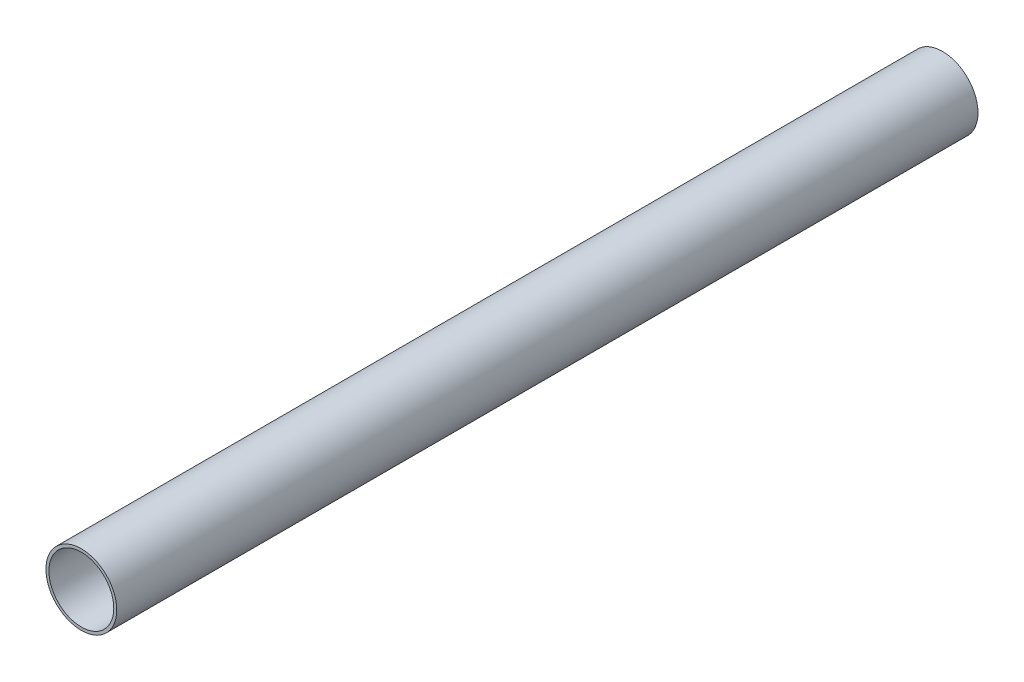
ISO-10303-21;
HEADER;
FILE_DESCRIPTION(('STEP AP214'),'2;1');
FILE_NAME('part.step','',(''),(''),'','','');
FILE_SCHEMA(('AUTOMOTIVE_DESIGN { 1 0 10303 214 1 1 1 1 }'));
ENDSEC;
DATA;
#1=APPLICATION_CONTEXT('core data for automotive mechanical design processes');
#2=APPLICATION_PROTOCOL_DEFINITION('international standard','automotive_design',2000,#1);
#3=PRODUCT_CONTEXT('',#1,'mechanical');
#4=PRODUCT('Part','Part','',(#3));
#5=PRODUCT_RELATED_PRODUCT_CATEGORY('part','',(#4));
#6=PRODUCT_DEFINITION_FORMATION('','',#4);
#7=PRODUCT_DEFINITION_CONTEXT('part definition',#1,'design');
#8=PRODUCT_DEFINITION('design','',#6,#7);
#9=PRODUCT_DEFINITION_SHAPE('','',#8);
#10=(LENGTH_UNIT() NAMED_UNIT(*) SI_UNIT(.MILLI.,.METRE.));
#11=(NAMED_UNIT(*) PLANE_ANGLE_UNIT() SI_UNIT($,.RADIAN.));
#12=(NAMED_UNIT(*) SI_UNIT($,.STERADIAN.) SOLID_ANGLE_UNIT());
#13=UNCERTAINTY_MEASURE_WITH_UNIT(LENGTH_MEASURE(1.E-05),#10,'distance_accuracy_value','');
#14=(GEOMETRIC_REPRESENTATION_CONTEXT(3) GLOBAL_UNCERTAINTY_ASSIGNED_CONTEXT((#13)) GLOBAL_UNIT_ASSIGNED_CONTEXT((#10,
#11,#12)) REPRESENTATION_CONTEXT('',''));
#15=CARTESIAN_POINT('',(0.,0.,0.));
#16=DIRECTION('',(0.,0.,1.));
#17=DIRECTION('',(1.,0.,0.));
#18=AXIS2_PLACEMENT_3D('',#15,#16,#17);
#19=CARTESIAN_POINT('',(0.,0.,463.55));
#20=DIRECTION('',(0.,0.,1.));
#21=DIRECTION('',(1.,0.,0.));
#22=AXIS2_PLACEMENT_3D('',#19,#20,#21);
#23=PLANE('',#22);
#24=CARTESIAN_POINT('',(0.,0.,463.55));
#25=DIRECTION('',(0.,0.,1.));
#26=DIRECTION('',(1.,0.,0.));
#27=AXIS2_PLACEMENT_3D('',#24,#25,#26);
#28=CIRCLE('',#27,19.05);
#29=CARTESIAN_POINT('',(19.05,0.,463.55));
#30=VERTEX_POINT('',#29);
#31=EDGE_CURVE('E10',#30,#30,#28,.T.);
#32=ORIENTED_EDGE('',*,*,#31,.T.);
#33=EDGE_LOOP('',(#32));
#34=FACE_BOUND('',#33,.T.);
#35=CARTESIAN_POINT('',(0.,0.,463.55));
#36=DIRECTION('',(0.,0.,1.));
#37=DIRECTION('',(1.,0.,0.));
#38=AXIS2_PLACEMENT_3D('',#35,#36,#37);
#39=CIRCLE('',#38,17.4625);
#40=CARTESIAN_POINT('',(17.4625,0.,463.55));
#41=VERTEX_POINT('',#40);
#42=EDGE_CURVE('E50',#41,#41,#39,.T.);
#43=ORIENTED_EDGE('',*,*,#42,.F.);
#44=EDGE_LOOP('',(#43));
#45=FACE_BOUND('',#44,.T.);
#46=ADVANCED_FACE('F39',(#34,#45),#23,.T.);
#47=CARTESIAN_POINT('',(0.,0.,0.));
#48=DIRECTION('',(0.,0.,1.));
#49=DIRECTION('',(1.,0.,0.));
#50=AXIS2_PLACEMENT_3D('',#47,#48,#49);
#51=PLANE('',#50);
#52=CARTESIAN_POINT('',(0.,0.,0.));
#53=DIRECTION('',(0.,0.,1.));
#54=DIRECTION('',(1.,0.,0.));
#55=AXIS2_PLACEMENT_3D('',#52,#53,#54);
#56=CIRCLE('',#55,19.05);
#57=CARTESIAN_POINT('',(19.05,0.,0.));
#58=VERTEX_POINT('',#57);
#59=EDGE_CURVE('E43',#58,#58,#56,.T.);
#60=ORIENTED_EDGE('',*,*,#59,.F.);
#61=EDGE_LOOP('',(#60));
#62=FACE_BOUND('',#61,.T.);
#63=CARTESIAN_POINT('',(0.,0.,0.));
#64=DIRECTION('',(0.,0.,1.));
#65=DIRECTION('',(1.,0.,0.));
#66=AXIS2_PLACEMENT_3D('',#63,#64,#65);
#67=CIRCLE('',#66,17.4625);
#68=CARTESIAN_POINT('',(17.4625,0.,0.));
#69=VERTEX_POINT('',#68);
#70=EDGE_CURVE('E52',#69,#69,#67,.T.);
#71=ORIENTED_EDGE('',*,*,#70,.T.);
#72=EDGE_LOOP('',(#71));
#73=FACE_BOUND('',#72,.T.);
#74=ADVANCED_FACE('F62',(#62,#73),#51,.F.);
#75=CARTESIAN_POINT('',(0.,0.,463.55));
#76=DIRECTION('',(0.,0.,-1.));
#77=DIRECTION('',(-1.,0.,0.));
#78=AXIS2_PLACEMENT_3D('',#75,#76,#77);
#79=CYLINDRICAL_SURFACE('',#78,19.05);
#80=ORIENTED_EDGE('',*,*,#31,.F.);
#81=EDGE_LOOP('',(#80));
#82=FACE_BOUND('',#81,.T.);
#83=ORIENTED_EDGE('',*,*,#59,.T.);
#84=EDGE_LOOP('',(#83));
#85=FACE_BOUND('',#84,.T.);
#86=ADVANCED_FACE('F41',(#82,#85),#79,.T.);
#87=CARTESIAN_POINT('',(0.,0.,463.55));
#88=DIRECTION('',(0.,0.,-1.));
#89=DIRECTION('',(-1.,0.,0.));
#90=AXIS2_PLACEMENT_3D('',#87,#88,#89);
#91=CYLINDRICAL_SURFACE('',#90,17.4625);
#92=ORIENTED_EDGE('',*,*,#42,.T.);
#93=EDGE_LOOP('',(#92));
#94=FACE_BOUND('',#93,.T.);
#95=ORIENTED_EDGE('',*,*,#70,.F.);
#96=EDGE_LOOP('',(#95));
#97=FACE_BOUND('',#96,.T.);
#98=ADVANCED_FACE('F58',(#94,#97),#91,.F.);
#99=CLOSED_SHELL('',(#46,#74,#86,#98));
#100=MANIFOLD_SOLID_BREP('B2',#99);
#101=ADVANCED_BREP_SHAPE_REPRESENTATION('',(#18,#100),#14);
#102=SHAPE_DEFINITION_REPRESENTATION(#9,#101);
ENDSEC;
END-ISO-10303-21;
